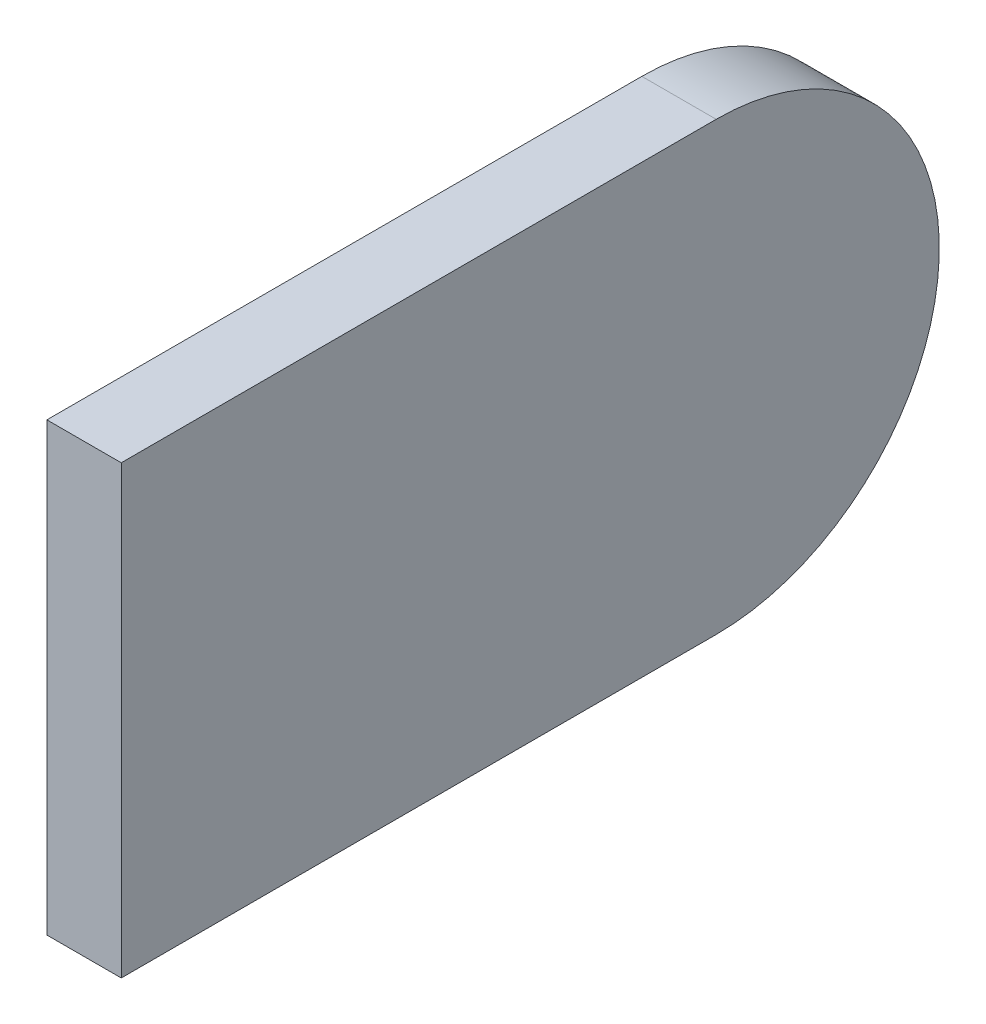
ISO-10303-21;
HEADER;
FILE_DESCRIPTION(('STEP AP214'),'2;1');
FILE_NAME('part.step','',(''),(''),'','','');
FILE_SCHEMA(('AUTOMOTIVE_DESIGN { 1 0 10303 214 1 1 1 1 }'));
ENDSEC;
DATA;
#1=APPLICATION_CONTEXT('core data for automotive mechanical design processes');
#2=APPLICATION_PROTOCOL_DEFINITION('international standard','automotive_design',2000,#1);
#3=PRODUCT_CONTEXT('',#1,'mechanical');
#4=PRODUCT('Part','Part','',(#3));
#5=PRODUCT_RELATED_PRODUCT_CATEGORY('part','',(#4));
#6=PRODUCT_DEFINITION_FORMATION('','',#4);
#7=PRODUCT_DEFINITION_CONTEXT('part definition',#1,'design');
#8=PRODUCT_DEFINITION('design','',#6,#7);
#9=PRODUCT_DEFINITION_SHAPE('','',#8);
#10=(LENGTH_UNIT() NAMED_UNIT(*) SI_UNIT(.MILLI.,.METRE.));
#11=(NAMED_UNIT(*) PLANE_ANGLE_UNIT() SI_UNIT($,.RADIAN.));
#12=(NAMED_UNIT(*) SI_UNIT($,.STERADIAN.) SOLID_ANGLE_UNIT());
#13=UNCERTAINTY_MEASURE_WITH_UNIT(LENGTH_MEASURE(1.E-05),#10,'distance_accuracy_value','');
#14=(GEOMETRIC_REPRESENTATION_CONTEXT(3) GLOBAL_UNCERTAINTY_ASSIGNED_CONTEXT((#13)) GLOBAL_UNIT_ASSIGNED_CONTEXT((#10,
#11,#12)) REPRESENTATION_CONTEXT('',''));
#15=CARTESIAN_POINT('',(0.,0.,0.));
#16=DIRECTION('',(0.,0.,1.));
#17=DIRECTION('',(1.,0.,0.));
#18=AXIS2_PLACEMENT_3D('',#15,#16,#17);
#19=CARTESIAN_POINT('',(10.,0.,0.));
#20=DIRECTION('',(0.,0.,-1.));
#21=DIRECTION('',(-1.,0.,0.));
#22=AXIS2_PLACEMENT_3D('',#19,#20,#21);
#23=PLANE('',#22);
#24=DIRECTION('',(0.,-1.,0.));
#25=VECTOR('',#24,1.);
#26=CARTESIAN_POINT('',(0.,0.,0.));
#27=LINE('',#26,#25);
#28=CARTESIAN_POINT('',(0.,60.,0.));
#29=VERTEX_POINT('',#28);
#30=CARTESIAN_POINT('',(0.,0.,0.));
#31=VERTEX_POINT('',#30);
#32=EDGE_CURVE('E107',#29,#31,#27,.T.);
#33=ORIENTED_EDGE('',*,*,#32,.T.);
#34=DIRECTION('',(-1.,0.,0.));
#35=VECTOR('',#34,1.);
#36=CARTESIAN_POINT('',(10.,0.,0.));
#37=LINE('',#36,#35);
#38=CARTESIAN_POINT('',(10.,0.,0.));
#39=VERTEX_POINT('',#38);
#40=EDGE_CURVE('E11',#39,#31,#37,.T.);
#41=ORIENTED_EDGE('',*,*,#40,.F.);
#42=DIRECTION('',(0.,-1.,0.));
#43=VECTOR('',#42,1.);
#44=CARTESIAN_POINT('',(10.,0.,0.));
#45=LINE('',#44,#43);
#46=CARTESIAN_POINT('',(10.,60.,0.));
#47=VERTEX_POINT('',#46);
#48=EDGE_CURVE('E91',#47,#39,#45,.T.);
#49=ORIENTED_EDGE('',*,*,#48,.F.);
#50=DIRECTION('',(-1.,0.,0.));
#51=VECTOR('',#50,1.);
#52=CARTESIAN_POINT('',(10.,60.,0.));
#53=LINE('',#52,#51);
#54=EDGE_CURVE('E103',#47,#29,#53,.T.);
#55=ORIENTED_EDGE('',*,*,#54,.T.);
#56=EDGE_LOOP('',(#33,#41,#49,#55));
#57=FACE_BOUND('',#56,.T.);
#58=ADVANCED_FACE('F39',(#57),#23,.F.);
#59=CARTESIAN_POINT('',(10.,0.,0.));
#60=DIRECTION('',(0.,1.,0.));
#61=DIRECTION('',(0.,0.,1.));
#62=AXIS2_PLACEMENT_3D('',#59,#60,#61);
#63=PLANE('',#62);
#64=DIRECTION('',(0.,0.,-1.));
#65=VECTOR('',#64,1.);
#66=CARTESIAN_POINT('',(0.,0.,0.));
#67=LINE('',#66,#65);
#68=CARTESIAN_POINT('',(0.,0.,-80.));
#69=VERTEX_POINT('',#68);
#70=EDGE_CURVE('E96',#31,#69,#67,.T.);
#71=ORIENTED_EDGE('',*,*,#70,.T.);
#72=DIRECTION('',(-1.,0.,0.));
#73=VECTOR('',#72,1.);
#74=CARTESIAN_POINT('',(10.,0.,-80.));
#75=LINE('',#74,#73);
#76=CARTESIAN_POINT('',(10.,0.,-80.));
#77=VERTEX_POINT('',#76);
#78=EDGE_CURVE('E48',#77,#69,#75,.T.);
#79=ORIENTED_EDGE('',*,*,#78,.F.);
#80=DIRECTION('',(0.,0.,-1.));
#81=VECTOR('',#80,1.);
#82=CARTESIAN_POINT('',(10.,0.,0.));
#83=LINE('',#82,#81);
#84=EDGE_CURVE('E86',#39,#77,#83,.T.);
#85=ORIENTED_EDGE('',*,*,#84,.F.);
#86=ORIENTED_EDGE('',*,*,#40,.T.);
#87=EDGE_LOOP('',(#71,#79,#85,#86));
#88=FACE_BOUND('',#87,.T.);
#89=ADVANCED_FACE('F95',(#88),#63,.F.);
#90=CARTESIAN_POINT('',(10.,30.,-80.));
#91=DIRECTION('',(-1.,0.,0.));
#92=DIRECTION('',(0.,0.,1.));
#93=AXIS2_PLACEMENT_3D('',#90,#91,#92);
#94=CYLINDRICAL_SURFACE('',#93,30.);
#95=CARTESIAN_POINT('',(0.,30.,-80.));
#96=DIRECTION('',(1.,0.,0.));
#97=DIRECTION('',(0.,0.,1.));
#98=AXIS2_PLACEMENT_3D('',#95,#96,#97);
#99=CIRCLE('',#98,30.);
#100=CARTESIAN_POINT('',(0.,60.,-80.));
#101=VERTEX_POINT('',#100);
#102=EDGE_CURVE('E73',#69,#101,#99,.T.);
#103=ORIENTED_EDGE('',*,*,#102,.T.);
#104=DIRECTION('',(-1.,0.,0.));
#105=VECTOR('',#104,1.);
#106=CARTESIAN_POINT('',(10.,60.,-80.));
#107=LINE('',#106,#105);
#108=CARTESIAN_POINT('',(10.,60.,-80.));
#109=VERTEX_POINT('',#108);
#110=EDGE_CURVE('E98',#109,#101,#107,.T.);
#111=ORIENTED_EDGE('',*,*,#110,.F.);
#112=CARTESIAN_POINT('',(10.,30.,-80.));
#113=DIRECTION('',(1.,0.,0.));
#114=DIRECTION('',(0.,0.,1.));
#115=AXIS2_PLACEMENT_3D('',#112,#113,#114);
#116=CIRCLE('',#115,30.);
#117=EDGE_CURVE('E89',#77,#109,#116,.T.);
#118=ORIENTED_EDGE('',*,*,#117,.F.);
#119=ORIENTED_EDGE('',*,*,#78,.T.);
#120=EDGE_LOOP('',(#103,#111,#118,#119));
#121=FACE_BOUND('',#120,.T.);
#122=ADVANCED_FACE('F99',(#121),#94,.T.);
#123=CARTESIAN_POINT('',(10.,60.,0.));
#124=DIRECTION('',(0.,-1.,0.));
#125=DIRECTION('',(0.,0.,-1.));
#126=AXIS2_PLACEMENT_3D('',#123,#124,#125);
#127=PLANE('',#126);
#128=DIRECTION('',(0.,0.,1.));
#129=VECTOR('',#128,1.);
#130=CARTESIAN_POINT('',(0.,60.,0.));
#131=LINE('',#130,#129);
#132=EDGE_CURVE('E79',#101,#29,#131,.T.);
#133=ORIENTED_EDGE('',*,*,#132,.T.);
#134=ORIENTED_EDGE('',*,*,#54,.F.);
#135=DIRECTION('',(0.,0.,1.));
#136=VECTOR('',#135,1.);
#137=CARTESIAN_POINT('',(10.,60.,0.));
#138=LINE('',#137,#136);
#139=EDGE_CURVE('E56',#109,#47,#138,.T.);
#140=ORIENTED_EDGE('',*,*,#139,.F.);
#141=ORIENTED_EDGE('',*,*,#110,.T.);
#142=EDGE_LOOP('',(#133,#134,#140,#141));
#143=FACE_BOUND('',#142,.T.);
#144=ADVANCED_FACE('F120',(#143),#127,.F.);
#145=CARTESIAN_POINT('',(10.,30.,-80.));
#146=DIRECTION('',(-1.,0.,0.));
#147=DIRECTION('',(0.,0.,1.));
#148=AXIS2_PLACEMENT_3D('',#145,#146,#147);
#149=PLANE('',#148);
#150=ORIENTED_EDGE('',*,*,#48,.T.);
#151=ORIENTED_EDGE('',*,*,#84,.T.);
#152=ORIENTED_EDGE('',*,*,#117,.T.);
#153=ORIENTED_EDGE('',*,*,#139,.T.);
#154=EDGE_LOOP('',(#150,#151,#152,#153));
#155=FACE_BOUND('',#154,.T.);
#156=ADVANCED_FACE('F87',(#155),#149,.F.);
#157=CARTESIAN_POINT('',(0.,30.,-80.));
#158=DIRECTION('',(-1.,0.,0.));
#159=DIRECTION('',(0.,0.,1.));
#160=AXIS2_PLACEMENT_3D('',#157,#158,#159);
#161=PLANE('',#160);
#162=ORIENTED_EDGE('',*,*,#32,.F.);
#163=ORIENTED_EDGE('',*,*,#132,.F.);
#164=ORIENTED_EDGE('',*,*,#102,.F.);
#165=ORIENTED_EDGE('',*,*,#70,.F.);
#166=EDGE_LOOP('',(#162,#163,#164,#165));
#167=FACE_BOUND('',#166,.T.);
#168=ADVANCED_FACE('F123',(#167),#161,.T.);
#169=CLOSED_SHELL('',(#58,#89,#122,#144,#156,#168));
#170=MANIFOLD_SOLID_BREP('B2',#169);
#171=ADVANCED_BREP_SHAPE_REPRESENTATION('',(#18,#170),#14);
#172=SHAPE_DEFINITION_REPRESENTATION(#9,#171);
ENDSEC;
END-ISO-10303-21;
